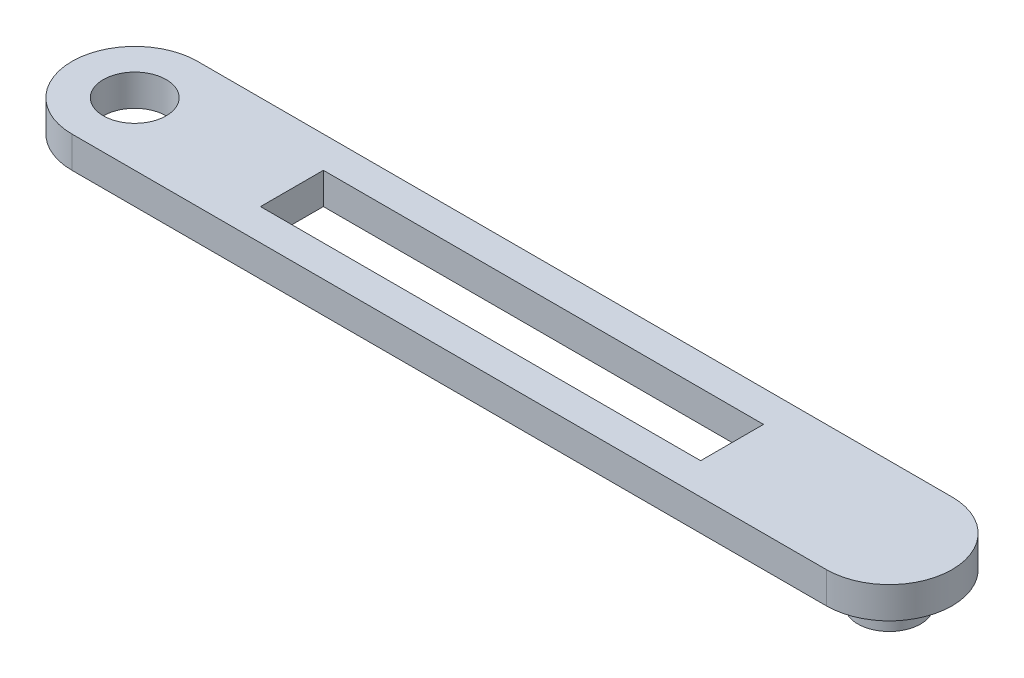
ISO-10303-21;
HEADER;
FILE_DESCRIPTION(('STEP AP214'),'2;1');
FILE_NAME('part.step','',(''),(''),'','','');
FILE_SCHEMA(('AUTOMOTIVE_DESIGN { 1 0 10303 214 1 1 1 1 }'));
ENDSEC;
DATA;
#1=APPLICATION_CONTEXT('core data for automotive mechanical design processes');
#2=APPLICATION_PROTOCOL_DEFINITION('international standard','automotive_design',2000,#1);
#3=PRODUCT_CONTEXT('',#1,'mechanical');
#4=PRODUCT('Part','Part','',(#3));
#5=PRODUCT_RELATED_PRODUCT_CATEGORY('part','',(#4));
#6=PRODUCT_DEFINITION_FORMATION('','',#4);
#7=PRODUCT_DEFINITION_CONTEXT('part definition',#1,'design');
#8=PRODUCT_DEFINITION('design','',#6,#7);
#9=PRODUCT_DEFINITION_SHAPE('','',#8);
#10=(LENGTH_UNIT() NAMED_UNIT(*) SI_UNIT(.MILLI.,.METRE.));
#11=(NAMED_UNIT(*) PLANE_ANGLE_UNIT() SI_UNIT($,.RADIAN.));
#12=(NAMED_UNIT(*) SI_UNIT($,.STERADIAN.) SOLID_ANGLE_UNIT());
#13=UNCERTAINTY_MEASURE_WITH_UNIT(LENGTH_MEASURE(1.E-05),#10,'distance_accuracy_value','');
#14=(GEOMETRIC_REPRESENTATION_CONTEXT(3) GLOBAL_UNCERTAINTY_ASSIGNED_CONTEXT((#13)) GLOBAL_UNIT_ASSIGNED_CONTEXT((#10,
#11,#12)) REPRESENTATION_CONTEXT('',''));
#15=CARTESIAN_POINT('',(0.,0.,0.));
#16=DIRECTION('',(0.,0.,1.));
#17=DIRECTION('',(1.,0.,0.));
#18=AXIS2_PLACEMENT_3D('',#15,#16,#17);
#19=CARTESIAN_POINT('',(43.4793252721429,-15.,0.));
#20=DIRECTION('',(0.,-1.,0.));
#21=DIRECTION('',(0.,0.,-1.));
#22=AXIS2_PLACEMENT_3D('',#19,#20,#21);
#23=PLANE('',#22);
#24=CARTESIAN_POINT('',(104.958650544286,-15.,14.989335089922));
#25=DIRECTION('',(0.,-1.,0.));
#26=DIRECTION('',(0.,0.,-1.));
#27=AXIS2_PLACEMENT_3D('',#24,#25,#26);
#28=CIRCLE('',#27,5.);
#29=CARTESIAN_POINT('',(104.958650544286,-15.,9.98933508992196));
#30=VERTEX_POINT('',#29);
#31=EDGE_CURVE('E11',#30,#30,#28,.T.);
#32=ORIENTED_EDGE('',*,*,#31,.T.);
#33=EDGE_LOOP('',(#32));
#34=FACE_BOUND('',#33,.T.);
#35=ADVANCED_FACE('F16',(#34),#23,.T.);
#36=CARTESIAN_POINT('',(104.958650544286,-15.,14.989335089922));
#37=DIRECTION('',(0.,1.,0.));
#38=DIRECTION('',(0.,0.,1.));
#39=AXIS2_PLACEMENT_3D('',#36,#37,#38);
#40=CYLINDRICAL_SURFACE('',#39,5.);
#41=ORIENTED_EDGE('',*,*,#31,.F.);
#42=EDGE_LOOP('',(#41));
#43=FACE_BOUND('',#42,.T.);
#44=CARTESIAN_POINT('',(104.958650544286,-10.,14.989335089922));
#45=DIRECTION('',(0.,-1.,0.));
#46=DIRECTION('',(0.,0.,-1.));
#47=AXIS2_PLACEMENT_3D('',#44,#45,#46);
#48=CIRCLE('',#47,5.);
#49=CARTESIAN_POINT('',(104.958650544286,-10.,9.98933508992196));
#50=VERTEX_POINT('',#49);
#51=EDGE_CURVE('E26',#50,#50,#48,.T.);
#52=ORIENTED_EDGE('',*,*,#51,.T.);
#53=EDGE_LOOP('',(#52));
#54=FACE_BOUND('',#53,.T.);
#55=ADVANCED_FACE('F252',(#43,#54),#40,.T.);
#56=CARTESIAN_POINT('',(43.4793252721429,-5.,0.));
#57=DIRECTION('',(0.,-1.,0.));
#58=DIRECTION('',(0.,0.,-1.));
#59=AXIS2_PLACEMENT_3D('',#56,#57,#58);
#60=PLANE('',#59);
#61=CARTESIAN_POINT('',(-15.0413494557143,-5.,14.9893350899219));
#62=DIRECTION('',(0.,-1.,0.));
#63=DIRECTION('',(0.,0.,-1.));
#64=AXIS2_PLACEMENT_3D('',#61,#62,#63);
#65=CIRCLE('',#64,5.);
#66=CARTESIAN_POINT('',(-15.0413494557143,-5.,9.98933508992194));
#67=VERTEX_POINT('',#66);
#68=EDGE_CURVE('E163',#67,#67,#65,.T.);
#69=ORIENTED_EDGE('',*,*,#68,.T.);
#70=EDGE_LOOP('',(#69));
#71=FACE_BOUND('',#70,.T.);
#72=DIRECTION('',(0.,0.,-1.));
#73=VECTOR('',#72,1.);
#74=CARTESIAN_POINT('',(9.95865054428577,-5.,14.9893350899219));
#75=LINE('',#74,#73);
#76=CARTESIAN_POINT('',(9.95865054428577,-5.,19.9893350899219));
#77=VERTEX_POINT('',#76);
#78=CARTESIAN_POINT('',(9.95865054428577,-5.,9.98933508992195));
#79=VERTEX_POINT('',#78);
#80=EDGE_CURVE('E170',#77,#79,#75,.T.);
#81=ORIENTED_EDGE('',*,*,#80,.T.);
#82=DIRECTION('',(1.,0.,0.));
#83=VECTOR('',#82,1.);
#84=CARTESIAN_POINT('',(44.9586505442858,-5.,9.98933508992195));
#85=LINE('',#84,#83);
#86=CARTESIAN_POINT('',(79.9586505442858,-5.,9.98933508992195));
#87=VERTEX_POINT('',#86);
#88=EDGE_CURVE('E159',#79,#87,#85,.T.);
#89=ORIENTED_EDGE('',*,*,#88,.T.);
#90=DIRECTION('',(0.,0.,-1.));
#91=VECTOR('',#90,1.);
#92=CARTESIAN_POINT('',(79.9586505442858,-5.,14.9893350899219));
#93=LINE('',#92,#91);
#94=CARTESIAN_POINT('',(79.9586505442858,-5.,19.9893350899219));
#95=VERTEX_POINT('',#94);
#96=EDGE_CURVE('E179',#95,#87,#93,.T.);
#97=ORIENTED_EDGE('',*,*,#96,.F.);
#98=DIRECTION('',(1.,0.,0.));
#99=VECTOR('',#98,1.);
#100=CARTESIAN_POINT('',(44.9586505442858,-5.,19.9893350899219));
#101=LINE('',#100,#99);
#102=EDGE_CURVE('E20',#77,#95,#101,.T.);
#103=ORIENTED_EDGE('',*,*,#102,.F.);
#104=EDGE_LOOP('',(#81,#89,#97,#103));
#105=FACE_BOUND('',#104,.T.);
#106=CARTESIAN_POINT('',(-15.0413494557143,-5.,14.9893350899219));
#107=DIRECTION('',(0.,1.,0.));
#108=DIRECTION('',(0.,0.,-1.));
#109=AXIS2_PLACEMENT_3D('',#106,#107,#108);
#110=CIRCLE('',#109,10.);
#111=CARTESIAN_POINT('',(-15.0413494557143,-5.,4.98933508992195));
#112=VERTEX_POINT('',#111);
#113=CARTESIAN_POINT('',(-15.0413494557143,-5.,24.9893350899219));
#114=VERTEX_POINT('',#113);
#115=EDGE_CURVE('E135',#112,#114,#110,.T.);
#116=ORIENTED_EDGE('',*,*,#115,.T.);
#117=DIRECTION('',(1.,0.,0.));
#118=VECTOR('',#117,1.);
#119=CARTESIAN_POINT('',(44.9586505442858,-5.,24.9893350899219));
#120=LINE('',#119,#118);
#121=CARTESIAN_POINT('',(104.958650544286,-5.,24.9893350899219));
#122=VERTEX_POINT('',#121);
#123=EDGE_CURVE('E117',#114,#122,#120,.T.);
#124=ORIENTED_EDGE('',*,*,#123,.T.);
#125=CARTESIAN_POINT('',(104.958650544286,-5.,14.989335089922));
#126=DIRECTION('',(0.,-1.,0.));
#127=DIRECTION('',(0.,0.,-1.));
#128=AXIS2_PLACEMENT_3D('',#125,#126,#127);
#129=CIRCLE('',#128,10.);
#130=CARTESIAN_POINT('',(104.958650544286,-5.,4.98933508992196));
#131=VERTEX_POINT('',#130);
#132=EDGE_CURVE('E169',#131,#122,#129,.T.);
#133=ORIENTED_EDGE('',*,*,#132,.F.);
#134=DIRECTION('',(1.,0.,0.));
#135=VECTOR('',#134,1.);
#136=CARTESIAN_POINT('',(44.9586505442858,-5.,4.98933508992194));
#137=LINE('',#136,#135);
#138=EDGE_CURVE('E139',#112,#131,#137,.T.);
#139=ORIENTED_EDGE('',*,*,#138,.F.);
#140=EDGE_LOOP('',(#116,#124,#133,#139));
#141=FACE_BOUND('',#140,.T.);
#142=ADVANCED_FACE('F18',(#71,#105,#141),#60,.F.);
#143=CARTESIAN_POINT('',(43.4793252721429,-10.,0.));
#144=DIRECTION('',(0.,-1.,0.));
#145=DIRECTION('',(0.,0.,-1.));
#146=AXIS2_PLACEMENT_3D('',#143,#144,#145);
#147=PLANE('',#146);
#148=CARTESIAN_POINT('',(-15.0413494557143,-10.,14.9893350899219));
#149=DIRECTION('',(0.,-1.,0.));
#150=DIRECTION('',(0.,0.,-1.));
#151=AXIS2_PLACEMENT_3D('',#148,#149,#150);
#152=CIRCLE('',#151,5.);
#153=CARTESIAN_POINT('',(-15.0413494557143,-10.,9.98933508992194));
#154=VERTEX_POINT('',#153);
#155=EDGE_CURVE('E165',#154,#154,#152,.T.);
#156=ORIENTED_EDGE('',*,*,#155,.F.);
#157=EDGE_LOOP('',(#156));
#158=FACE_BOUND('',#157,.T.);
#159=ORIENTED_EDGE('',*,*,#51,.F.);
#160=EDGE_LOOP('',(#159));
#161=FACE_BOUND('',#160,.T.);
#162=DIRECTION('',(0.,0.,-1.));
#163=VECTOR('',#162,1.);
#164=CARTESIAN_POINT('',(9.95865054428577,-10.,14.9893350899219));
#165=LINE('',#164,#163);
#166=CARTESIAN_POINT('',(9.95865054428577,-10.,19.9893350899219));
#167=VERTEX_POINT('',#166);
#168=CARTESIAN_POINT('',(9.95865054428577,-10.,9.98933508992195));
#169=VERTEX_POINT('',#168);
#170=EDGE_CURVE('E205',#167,#169,#165,.T.);
#171=ORIENTED_EDGE('',*,*,#170,.F.);
#172=DIRECTION('',(1.,0.,0.));
#173=VECTOR('',#172,1.);
#174=CARTESIAN_POINT('',(44.9586505442858,-10.,19.9893350899219));
#175=LINE('',#174,#173);
#176=CARTESIAN_POINT('',(79.9586505442858,-10.,19.9893350899219));
#177=VERTEX_POINT('',#176);
#178=EDGE_CURVE('E175',#167,#177,#175,.T.);
#179=ORIENTED_EDGE('',*,*,#178,.T.);
#180=DIRECTION('',(0.,0.,-1.));
#181=VECTOR('',#180,1.);
#182=CARTESIAN_POINT('',(79.9586505442858,-10.,14.9893350899219));
#183=LINE('',#182,#181);
#184=CARTESIAN_POINT('',(79.9586505442858,-10.,9.98933508992195));
#185=VERTEX_POINT('',#184);
#186=EDGE_CURVE('E145',#177,#185,#183,.T.);
#187=ORIENTED_EDGE('',*,*,#186,.T.);
#188=DIRECTION('',(1.,0.,0.));
#189=VECTOR('',#188,1.);
#190=CARTESIAN_POINT('',(44.9586505442858,-10.,9.98933508992195));
#191=LINE('',#190,#189);
#192=EDGE_CURVE('E129',#169,#185,#191,.T.);
#193=ORIENTED_EDGE('',*,*,#192,.F.);
#194=EDGE_LOOP('',(#171,#179,#187,#193));
#195=FACE_BOUND('',#194,.T.);
#196=CARTESIAN_POINT('',(-15.0413494557143,-10.,14.9893350899219));
#197=DIRECTION('',(0.,1.,0.));
#198=DIRECTION('',(0.,0.,-1.));
#199=AXIS2_PLACEMENT_3D('',#196,#197,#198);
#200=CIRCLE('',#199,10.);
#201=CARTESIAN_POINT('',(-15.0413494557143,-10.,4.98933508992195));
#202=VERTEX_POINT('',#201);
#203=CARTESIAN_POINT('',(-15.0413494557143,-10.,24.9893350899219));
#204=VERTEX_POINT('',#203);
#205=EDGE_CURVE('E137',#202,#204,#200,.T.);
#206=ORIENTED_EDGE('',*,*,#205,.F.);
#207=DIRECTION('',(1.,0.,0.));
#208=VECTOR('',#207,1.);
#209=CARTESIAN_POINT('',(44.9586505442858,-10.,4.98933508992194));
#210=LINE('',#209,#208);
#211=CARTESIAN_POINT('',(104.958650544286,-10.,4.98933508992196));
#212=VERTEX_POINT('',#211);
#213=EDGE_CURVE('E186',#202,#212,#210,.T.);
#214=ORIENTED_EDGE('',*,*,#213,.T.);
#215=CARTESIAN_POINT('',(104.958650544286,-10.,14.989335089922));
#216=DIRECTION('',(0.,-1.,0.));
#217=DIRECTION('',(0.,0.,-1.));
#218=AXIS2_PLACEMENT_3D('',#215,#216,#217);
#219=CIRCLE('',#218,10.);
#220=CARTESIAN_POINT('',(104.958650544286,-10.,24.9893350899219));
#221=VERTEX_POINT('',#220);
#222=EDGE_CURVE('E162',#212,#221,#219,.T.);
#223=ORIENTED_EDGE('',*,*,#222,.T.);
#224=DIRECTION('',(1.,0.,0.));
#225=VECTOR('',#224,1.);
#226=CARTESIAN_POINT('',(44.9586505442858,-10.,24.9893350899219));
#227=LINE('',#226,#225);
#228=EDGE_CURVE('E128',#204,#221,#227,.T.);
#229=ORIENTED_EDGE('',*,*,#228,.F.);
#230=EDGE_LOOP('',(#206,#214,#223,#229));
#231=FACE_BOUND('',#230,.T.);
#232=ADVANCED_FACE('F233',(#158,#161,#195,#231),#147,.T.);
#233=CARTESIAN_POINT('',(-15.0413494557143,-10.,14.9893350899219));
#234=DIRECTION('',(0.,1.,0.));
#235=DIRECTION('',(0.,0.,1.));
#236=AXIS2_PLACEMENT_3D('',#233,#234,#235);
#237=CYLINDRICAL_SURFACE('',#236,5.);
#238=ORIENTED_EDGE('',*,*,#68,.F.);
#239=EDGE_LOOP('',(#238));
#240=FACE_BOUND('',#239,.T.);
#241=ORIENTED_EDGE('',*,*,#155,.T.);
#242=EDGE_LOOP('',(#241));
#243=FACE_BOUND('',#242,.T.);
#244=ADVANCED_FACE('F259',(#240,#243),#237,.F.);
#245=CARTESIAN_POINT('',(44.9586505442858,-10.,24.9893350899219));
#246=DIRECTION('',(0.,0.,1.));
#247=DIRECTION('',(1.,0.,0.));
#248=AXIS2_PLACEMENT_3D('',#245,#246,#247);
#249=PLANE('',#248);
#250=ORIENTED_EDGE('',*,*,#123,.F.);
#251=DIRECTION('',(0.,1.,0.));
#252=VECTOR('',#251,1.);
#253=CARTESIAN_POINT('',(-15.0413494557143,-10.,24.9893350899219));
#254=LINE('',#253,#252);
#255=EDGE_CURVE('E120',#204,#114,#254,.T.);
#256=ORIENTED_EDGE('',*,*,#255,.F.);
#257=ORIENTED_EDGE('',*,*,#228,.T.);
#258=DIRECTION('',(0.,1.,0.));
#259=VECTOR('',#258,1.);
#260=CARTESIAN_POINT('',(104.958650544286,-10.,24.9893350899219));
#261=LINE('',#260,#259);
#262=EDGE_CURVE('E123',#221,#122,#261,.T.);
#263=ORIENTED_EDGE('',*,*,#262,.T.);
#264=EDGE_LOOP('',(#250,#256,#257,#263));
#265=FACE_BOUND('',#264,.T.);
#266=ADVANCED_FACE('F119',(#265),#249,.T.);
#267=CARTESIAN_POINT('',(44.9586505442858,-10.,9.98933508992195));
#268=DIRECTION('',(0.,0.,1.));
#269=DIRECTION('',(1.,0.,0.));
#270=AXIS2_PLACEMENT_3D('',#267,#268,#269);
#271=PLANE('',#270);
#272=ORIENTED_EDGE('',*,*,#88,.F.);
#273=DIRECTION('',(0.,1.,0.));
#274=VECTOR('',#273,1.);
#275=CARTESIAN_POINT('',(9.95865054428577,-10.,9.98933508992195));
#276=LINE('',#275,#274);
#277=EDGE_CURVE('E201',#169,#79,#276,.T.);
#278=ORIENTED_EDGE('',*,*,#277,.F.);
#279=ORIENTED_EDGE('',*,*,#192,.T.);
#280=DIRECTION('',(0.,1.,0.));
#281=VECTOR('',#280,1.);
#282=CARTESIAN_POINT('',(79.9586505442858,-10.,9.98933508992195));
#283=LINE('',#282,#281);
#284=EDGE_CURVE('E154',#185,#87,#283,.T.);
#285=ORIENTED_EDGE('',*,*,#284,.T.);
#286=EDGE_LOOP('',(#272,#278,#279,#285));
#287=FACE_BOUND('',#286,.T.);
#288=ADVANCED_FACE('F248',(#287),#271,.T.);
#289=CARTESIAN_POINT('',(104.958650544286,-10.,14.989335089922));
#290=DIRECTION('',(0.,1.,0.));
#291=DIRECTION('',(0.,0.,1.));
#292=AXIS2_PLACEMENT_3D('',#289,#290,#291);
#293=CYLINDRICAL_SURFACE('',#292,10.);
#294=ORIENTED_EDGE('',*,*,#132,.T.);
#295=ORIENTED_EDGE('',*,*,#262,.F.);
#296=ORIENTED_EDGE('',*,*,#222,.F.);
#297=DIRECTION('',(0.,1.,0.));
#298=VECTOR('',#297,1.);
#299=CARTESIAN_POINT('',(104.958650544286,-10.,4.98933508992196));
#300=LINE('',#299,#298);
#301=EDGE_CURVE('E182',#212,#131,#300,.T.);
#302=ORIENTED_EDGE('',*,*,#301,.T.);
#303=EDGE_LOOP('',(#294,#295,#296,#302));
#304=FACE_BOUND('',#303,.T.);
#305=ADVANCED_FACE('F236',(#304),#293,.T.);
#306=CARTESIAN_POINT('',(44.9586505442858,-10.,4.98933508992194));
#307=DIRECTION('',(0.,0.,1.));
#308=DIRECTION('',(1.,0.,0.));
#309=AXIS2_PLACEMENT_3D('',#306,#307,#308);
#310=PLANE('',#309);
#311=ORIENTED_EDGE('',*,*,#138,.T.);
#312=ORIENTED_EDGE('',*,*,#301,.F.);
#313=ORIENTED_EDGE('',*,*,#213,.F.);
#314=DIRECTION('',(0.,1.,0.));
#315=VECTOR('',#314,1.);
#316=CARTESIAN_POINT('',(-15.0413494557143,-10.,4.98933508992195));
#317=LINE('',#316,#315);
#318=EDGE_CURVE('E144',#202,#112,#317,.T.);
#319=ORIENTED_EDGE('',*,*,#318,.T.);
#320=EDGE_LOOP('',(#311,#312,#313,#319));
#321=FACE_BOUND('',#320,.T.);
#322=ADVANCED_FACE('F238',(#321),#310,.F.);
#323=CARTESIAN_POINT('',(-15.0413494557143,-10.,14.9893350899219));
#324=DIRECTION('',(0.,1.,0.));
#325=DIRECTION('',(0.,0.,1.));
#326=AXIS2_PLACEMENT_3D('',#323,#324,#325);
#327=CYLINDRICAL_SURFACE('',#326,10.);
#328=ORIENTED_EDGE('',*,*,#115,.F.);
#329=ORIENTED_EDGE('',*,*,#318,.F.);
#330=ORIENTED_EDGE('',*,*,#205,.T.);
#331=ORIENTED_EDGE('',*,*,#255,.T.);
#332=EDGE_LOOP('',(#328,#329,#330,#331));
#333=FACE_BOUND('',#332,.T.);
#334=ADVANCED_FACE('F133',(#333),#327,.T.);
#335=CARTESIAN_POINT('',(79.9586505442858,-10.,14.9893350899219));
#336=DIRECTION('',(1.,0.,0.));
#337=DIRECTION('',(0.,1.,0.));
#338=AXIS2_PLACEMENT_3D('',#335,#336,#337);
#339=PLANE('',#338);
#340=ORIENTED_EDGE('',*,*,#96,.T.);
#341=ORIENTED_EDGE('',*,*,#284,.F.);
#342=ORIENTED_EDGE('',*,*,#186,.F.);
#343=DIRECTION('',(0.,1.,0.));
#344=VECTOR('',#343,1.);
#345=CARTESIAN_POINT('',(79.9586505442858,-10.,19.9893350899219));
#346=LINE('',#345,#344);
#347=EDGE_CURVE('E157',#177,#95,#346,.T.);
#348=ORIENTED_EDGE('',*,*,#347,.T.);
#349=EDGE_LOOP('',(#340,#341,#342,#348));
#350=FACE_BOUND('',#349,.T.);
#351=ADVANCED_FACE('F246',(#350),#339,.F.);
#352=CARTESIAN_POINT('',(44.9586505442858,-10.,19.9893350899219));
#353=DIRECTION('',(0.,0.,1.));
#354=DIRECTION('',(1.,0.,0.));
#355=AXIS2_PLACEMENT_3D('',#352,#353,#354);
#356=PLANE('',#355);
#357=ORIENTED_EDGE('',*,*,#102,.T.);
#358=ORIENTED_EDGE('',*,*,#347,.F.);
#359=ORIENTED_EDGE('',*,*,#178,.F.);
#360=DIRECTION('',(0.,1.,0.));
#361=VECTOR('',#360,1.);
#362=CARTESIAN_POINT('',(9.95865054428577,-10.,19.9893350899219));
#363=LINE('',#362,#361);
#364=EDGE_CURVE('E174',#167,#77,#363,.T.);
#365=ORIENTED_EDGE('',*,*,#364,.T.);
#366=EDGE_LOOP('',(#357,#358,#359,#365));
#367=FACE_BOUND('',#366,.T.);
#368=ADVANCED_FACE('F277',(#367),#356,.F.);
#369=CARTESIAN_POINT('',(9.95865054428577,-10.,14.9893350899219));
#370=DIRECTION('',(1.,0.,0.));
#371=DIRECTION('',(0.,1.,0.));
#372=AXIS2_PLACEMENT_3D('',#369,#370,#371);
#373=PLANE('',#372);
#374=ORIENTED_EDGE('',*,*,#80,.F.);
#375=ORIENTED_EDGE('',*,*,#364,.F.);
#376=ORIENTED_EDGE('',*,*,#170,.T.);
#377=ORIENTED_EDGE('',*,*,#277,.T.);
#378=EDGE_LOOP('',(#374,#375,#376,#377));
#379=FACE_BOUND('',#378,.T.);
#380=ADVANCED_FACE('F280',(#379),#373,.T.);
#381=CLOSED_SHELL('',(#35,#55,#142,#232,#244,#266,#288,#305,#322,#334,#351,#368,#380));
#382=MANIFOLD_SOLID_BREP('B1',#381);
#383=ADVANCED_BREP_SHAPE_REPRESENTATION('',(#18,#382),#14);
#384=SHAPE_DEFINITION_REPRESENTATION(#9,#383);
ENDSEC;
END-ISO-10303-21;
